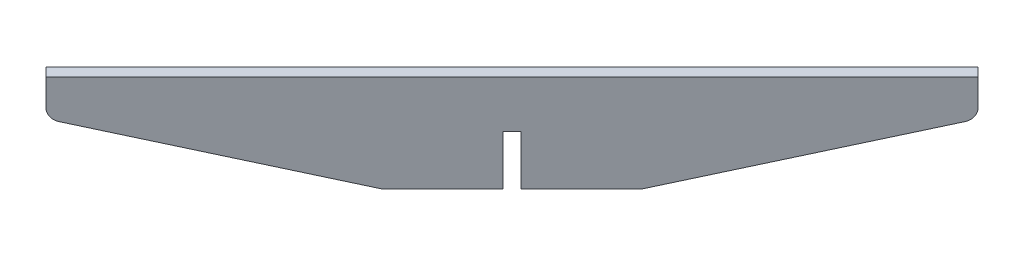
ISO-10303-21;
HEADER;
FILE_DESCRIPTION(('STEP AP214'),'2;1');
FILE_NAME('part.step','',(''),(''),'','','');
FILE_SCHEMA(('AUTOMOTIVE_DESIGN { 1 0 10303 214 1 1 1 1 }'));
ENDSEC;
DATA;
#1=APPLICATION_CONTEXT('core data for automotive mechanical design processes');
#2=APPLICATION_PROTOCOL_DEFINITION('international standard','automotive_design',2000,#1);
#3=PRODUCT_CONTEXT('',#1,'mechanical');
#4=PRODUCT('Part','Part','',(#3));
#5=PRODUCT_RELATED_PRODUCT_CATEGORY('part','',(#4));
#6=PRODUCT_DEFINITION_FORMATION('','',#4);
#7=PRODUCT_DEFINITION_CONTEXT('part definition',#1,'design');
#8=PRODUCT_DEFINITION('design','',#6,#7);
#9=PRODUCT_DEFINITION_SHAPE('','',#8);
#10=(LENGTH_UNIT() NAMED_UNIT(*) SI_UNIT(.MILLI.,.METRE.));
#11=(NAMED_UNIT(*) PLANE_ANGLE_UNIT() SI_UNIT($,.RADIAN.));
#12=(NAMED_UNIT(*) SI_UNIT($,.STERADIAN.) SOLID_ANGLE_UNIT());
#13=UNCERTAINTY_MEASURE_WITH_UNIT(LENGTH_MEASURE(1.E-05),#10,'distance_accuracy_value','');
#14=(GEOMETRIC_REPRESENTATION_CONTEXT(3) GLOBAL_UNCERTAINTY_ASSIGNED_CONTEXT((#13)) GLOBAL_UNIT_ASSIGNED_CONTEXT((#10,
#11,#12)) REPRESENTATION_CONTEXT('',''));
#15=CARTESIAN_POINT('',(0.,0.,0.));
#16=DIRECTION('',(0.,0.,1.));
#17=DIRECTION('',(1.,0.,0.));
#18=AXIS2_PLACEMENT_3D('',#15,#16,#17);
#19=CARTESIAN_POINT('',(56.5685424949238,-65.,-49.4974746830583));
#20=DIRECTION('',(0.,1.,0.));
#21=DIRECTION('',(0.,0.,1.));
#22=AXIS2_PLACEMENT_3D('',#19,#20,#21);
#23=PLANE('',#22);
#24=DIRECTION('',(0.707106781186548,0.,-0.707106781186548));
#25=VECTOR('',#24,1.);
#26=CARTESIAN_POINT('',(56.5685424949238,-65.,-49.4974746830583));
#27=LINE('',#26,#25);
#28=CARTESIAN_POINT('',(7.14177848998415,-65.,-0.0707106781186739));
#29=VERTEX_POINT('',#28);
#30=CARTESIAN_POINT('',(56.5685424949238,-65.,-49.4974746830583));
#31=VERTEX_POINT('',#30);
#32=EDGE_CURVE('E159',#29,#31,#27,.T.);
#33=ORIENTED_EDGE('',*,*,#32,.F.);
#34=DIRECTION('',(-0.707106781186548,0.,-0.707106781186548));
#35=VECTOR('',#34,1.);
#36=CARTESIAN_POINT('',(7.14177848998415,-65.,-0.070710678118667));
#37=LINE('',#36,#35);
#38=CARTESIAN_POINT('',(0.0707106781186731,-65.,-7.14177848998415));
#39=VERTEX_POINT('',#38);
#40=EDGE_CURVE('E215',#29,#39,#37,.T.);
#41=ORIENTED_EDGE('',*,*,#40,.T.);
#42=DIRECTION('',(0.707106781186548,0.,-0.707106781186548));
#43=VECTOR('',#42,1.);
#44=CARTESIAN_POINT('',(49.4974746830583,-65.,-56.5685424949238));
#45=LINE('',#44,#43);
#46=CARTESIAN_POINT('',(49.4974746830583,-65.,-56.5685424949238));
#47=VERTEX_POINT('',#46);
#48=EDGE_CURVE('E151',#39,#47,#45,.T.);
#49=ORIENTED_EDGE('',*,*,#48,.T.);
#50=DIRECTION('',(-0.707106781186548,0.,-0.707106781186548));
#51=VECTOR('',#50,1.);
#52=CARTESIAN_POINT('',(56.5685424949238,-65.,-49.4974746830583));
#53=LINE('',#52,#51);
#54=EDGE_CURVE('E183',#31,#47,#53,.T.);
#55=ORIENTED_EDGE('',*,*,#54,.F.);
#56=EDGE_LOOP('',(#33,#41,#49,#55));
#57=FACE_BOUND('',#56,.T.);
#58=ADVANCED_FACE('F35',(#57),#23,.F.);
#59=CARTESIAN_POINT('',(-195.,15.,187.928932188134));
#60=DIRECTION('',(0.707106781186549,0.,0.707106781186546));
#61=DIRECTION('',(0.707106781186546,0.,-0.707106781186549));
#62=AXIS2_PLACEMENT_3D('',#59,#60,#61);
#63=PLANE('',#62);
#64=DIRECTION('',(0.685115069909655,-0.247456424376855,-0.685115069909655));
#65=VECTOR('',#64,1.);
#66=CARTESIAN_POINT('',(-56.5685424949238,-65.,49.4974746830583));
#67=LINE('',#66,#65);
#68=CARTESIAN_POINT('',(-189.678713345385,-16.9219932920304,182.60764553352));
#69=VERTEX_POINT('',#68);
#70=CARTESIAN_POINT('',(-56.5685424949238,-65.,49.4974746830583));
#71=VERTEX_POINT('',#70);
#72=EDGE_CURVE('E149',#69,#71,#67,.T.);
#73=ORIENTED_EDGE('',*,*,#72,.F.);
#74=CARTESIAN_POINT('',(-187.928932188135,-7.23300305550616,180.857864376269));
#75=DIRECTION('',(0.707106781186549,0.,0.707106781186546));
#76=DIRECTION('',(0.707106781186546,0.,-0.707106781186549));
#77=AXIS2_PLACEMENT_3D('',#74,#75,#76);
#78=CIRCLE('',#77,10.);
#79=CARTESIAN_POINT('',(-195.,-7.23300305550616,187.928932188134));
#80=VERTEX_POINT('',#79);
#81=EDGE_CURVE('E12',#69,#80,#78,.F.);
#82=ORIENTED_EDGE('',*,*,#81,.T.);
#83=DIRECTION('',(0.,-1.,0.));
#84=VECTOR('',#83,1.);
#85=CARTESIAN_POINT('',(-195.,15.,187.928932188134));
#86=LINE('',#85,#84);
#87=CARTESIAN_POINT('',(-195.,15.,187.928932188134));
#88=VERTEX_POINT('',#87);
#89=EDGE_CURVE('E211',#88,#80,#86,.T.);
#90=ORIENTED_EDGE('',*,*,#89,.F.);
#91=DIRECTION('',(-0.707106781186546,0.,0.707106781186549));
#92=VECTOR('',#91,1.);
#93=CARTESIAN_POINT('',(-195.,15.,187.928932188134));
#94=LINE('',#93,#92);
#95=CARTESIAN_POINT('',(187.928932188135,15.,-195.000000000002));
#96=VERTEX_POINT('',#95);
#97=EDGE_CURVE('E194',#96,#88,#94,.T.);
#98=ORIENTED_EDGE('',*,*,#97,.F.);
#99=DIRECTION('',(0.,-1.,0.));
#100=VECTOR('',#99,1.);
#101=CARTESIAN_POINT('',(187.928932188135,15.,-195.000000000002));
#102=LINE('',#101,#100);
#103=CARTESIAN_POINT('',(187.928932188135,-7.23300305550577,-195.000000000002));
#104=VERTEX_POINT('',#103);
#105=EDGE_CURVE('E203',#96,#104,#102,.T.);
#106=ORIENTED_EDGE('',*,*,#105,.T.);
#107=CARTESIAN_POINT('',(180.857864376269,-7.23300305550577,-187.928932188136));
#108=DIRECTION('',(0.707106781186549,0.,0.707106781186546));
#109=DIRECTION('',(0.707106781186546,0.,-0.707106781186549));
#110=AXIS2_PLACEMENT_3D('',#107,#108,#109);
#111=CIRCLE('',#110,10.);
#112=CARTESIAN_POINT('',(182.607645533521,-16.92199329203,-189.678713345386));
#113=VERTEX_POINT('',#112);
#114=EDGE_CURVE('E222',#104,#113,#111,.F.);
#115=ORIENTED_EDGE('',*,*,#114,.T.);
#116=DIRECTION('',(0.685115069909655,0.247456424376855,-0.685115069909655));
#117=VECTOR('',#116,1.);
#118=CARTESIAN_POINT('',(187.928932188134,-15.,-195.));
#119=LINE('',#118,#117);
#120=EDGE_CURVE('E160',#47,#113,#119,.T.);
#121=ORIENTED_EDGE('',*,*,#120,.F.);
#122=ORIENTED_EDGE('',*,*,#48,.F.);
#123=DIRECTION('',(0.,1.,0.));
#124=VECTOR('',#123,1.);
#125=CARTESIAN_POINT('',(0.0707106781181743,15.,-7.14177848998462));
#126=LINE('',#125,#124);
#127=CARTESIAN_POINT('',(0.0707106781181605,-24.,-7.14177848998464));
#128=VERTEX_POINT('',#127);
#129=EDGE_CURVE('E148',#39,#128,#126,.T.);
#130=ORIENTED_EDGE('',*,*,#129,.T.);
#131=DIRECTION('',(-0.707106781186546,0.,0.707106781186549));
#132=VECTOR('',#131,1.);
#133=CARTESIAN_POINT('',(-195.,-24.,187.928932188134));
#134=LINE('',#133,#132);
#135=CARTESIAN_POINT('',(-7.14177848998464,-24.,0.0707106781181743));
#136=VERTEX_POINT('',#135);
#137=EDGE_CURVE('E139',#128,#136,#134,.T.);
#138=ORIENTED_EDGE('',*,*,#137,.T.);
#139=DIRECTION('',(0.,-1.,0.));
#140=VECTOR('',#139,1.);
#141=CARTESIAN_POINT('',(-7.14177848998465,15.,0.0707106781182298));
#142=LINE('',#141,#140);
#143=CARTESIAN_POINT('',(-7.14177848998411,-65.,0.070710678118628));
#144=VERTEX_POINT('',#143);
#145=EDGE_CURVE('E122',#136,#144,#142,.T.);
#146=ORIENTED_EDGE('',*,*,#145,.T.);
#147=EDGE_CURVE('E185',#71,#144,#45,.T.);
#148=ORIENTED_EDGE('',*,*,#147,.F.);
#149=EDGE_LOOP('',(#73,#82,#90,#98,#106,#115,#121,#122,#130,#138,#146,#148));
#150=FACE_BOUND('',#149,.T.);
#151=ADVANCED_FACE('F146',(#150),#63,.F.);
#152=CARTESIAN_POINT('',(-195.,15.,187.928932188134));
#153=DIRECTION('',(0.707106781186545,0.,-0.70710678118655));
#154=DIRECTION('',(-0.70710678118655,0.,-0.707106781186545));
#155=AXIS2_PLACEMENT_3D('',#152,#153,#154);
#156=PLANE('',#155);
#157=ORIENTED_EDGE('',*,*,#89,.T.);
#158=DIRECTION('',(0.70710678118655,0.,0.707106781186545));
#159=VECTOR('',#158,1.);
#160=CARTESIAN_POINT('',(-195.,-7.23300305550617,187.928932188134));
#161=LINE('',#160,#159);
#162=CARTESIAN_POINT('',(-187.928932188134,-7.23300305550617,195.));
#163=VERTEX_POINT('',#162);
#164=EDGE_CURVE('E228',#80,#163,#161,.T.);
#165=ORIENTED_EDGE('',*,*,#164,.T.);
#166=DIRECTION('',(0.,-1.,0.));
#167=VECTOR('',#166,1.);
#168=CARTESIAN_POINT('',(-187.928932188134,15.,195.));
#169=LINE('',#168,#167);
#170=CARTESIAN_POINT('',(-187.928932188134,15.,195.));
#171=VERTEX_POINT('',#170);
#172=EDGE_CURVE('E208',#171,#163,#169,.T.);
#173=ORIENTED_EDGE('',*,*,#172,.F.);
#174=DIRECTION('',(0.70710678118655,0.,0.707106781186545));
#175=VECTOR('',#174,1.);
#176=CARTESIAN_POINT('',(-195.,15.,187.928932188134));
#177=LINE('',#176,#175);
#178=EDGE_CURVE('E197',#88,#171,#177,.T.);
#179=ORIENTED_EDGE('',*,*,#178,.F.);
#180=EDGE_LOOP('',(#157,#165,#173,#179));
#181=FACE_BOUND('',#180,.T.);
#182=ADVANCED_FACE('F234',(#181),#156,.F.);
#183=CARTESIAN_POINT('',(-187.928932188134,15.,195.));
#184=DIRECTION('',(-0.707106781186549,0.,-0.707106781186546));
#185=DIRECTION('',(-0.707106781186546,0.,0.707106781186549));
#186=AXIS2_PLACEMENT_3D('',#183,#184,#185);
#187=PLANE('',#186);
#188=ORIENTED_EDGE('',*,*,#172,.T.);
#189=CARTESIAN_POINT('',(-180.857864376269,-7.23300305550617,187.928932188134));
#190=DIRECTION('',(-0.707106781186549,0.,-0.707106781186546));
#191=DIRECTION('',(-0.707106781186546,0.,0.707106781186549));
#192=AXIS2_PLACEMENT_3D('',#189,#190,#191);
#193=CIRCLE('',#192,10.);
#194=CARTESIAN_POINT('',(-182.60764553352,-16.9219932920304,189.678713345385));
#195=VERTEX_POINT('',#194);
#196=EDGE_CURVE('E57',#163,#195,#193,.F.);
#197=ORIENTED_EDGE('',*,*,#196,.T.);
#198=DIRECTION('',(0.685115069909655,-0.247456424376855,-0.685115069909655));
#199=VECTOR('',#198,1.);
#200=CARTESIAN_POINT('',(-49.4974746830583,-65.,56.5685424949238));
#201=LINE('',#200,#199);
#202=CARTESIAN_POINT('',(-49.4974746830583,-65.,56.5685424949238));
#203=VERTEX_POINT('',#202);
#204=EDGE_CURVE('E156',#195,#203,#201,.T.);
#205=ORIENTED_EDGE('',*,*,#204,.T.);
#206=CARTESIAN_POINT('',(-0.0707106781186288,-65.,7.14177848998411));
#207=VERTEX_POINT('',#206);
#208=EDGE_CURVE('E161',#203,#207,#27,.T.);
#209=ORIENTED_EDGE('',*,*,#208,.T.);
#210=DIRECTION('',(0.,1.,0.));
#211=VECTOR('',#210,1.);
#212=CARTESIAN_POINT('',(-0.070710678119118,15.,7.14177848998368));
#213=LINE('',#212,#211);
#214=CARTESIAN_POINT('',(-0.070710678119118,-24.,7.14177848998365));
#215=VERTEX_POINT('',#214);
#216=EDGE_CURVE('E134',#207,#215,#213,.T.);
#217=ORIENTED_EDGE('',*,*,#216,.T.);
#218=DIRECTION('',(0.707106781186546,0.,-0.707106781186549));
#219=VECTOR('',#218,1.);
#220=CARTESIAN_POINT('',(-187.928932188134,-24.,195.));
#221=LINE('',#220,#219);
#222=CARTESIAN_POINT('',(7.14177848998365,-24.,-0.0707106781191597));
#223=VERTEX_POINT('',#222);
#224=EDGE_CURVE('E142',#215,#223,#221,.T.);
#225=ORIENTED_EDGE('',*,*,#224,.T.);
#226=DIRECTION('',(0.,-1.,0.));
#227=VECTOR('',#226,1.);
#228=CARTESIAN_POINT('',(7.14177848998368,15.,-0.0707106781191458));
#229=LINE('',#228,#227);
#230=EDGE_CURVE('E133',#223,#29,#229,.T.);
#231=ORIENTED_EDGE('',*,*,#230,.T.);
#232=ORIENTED_EDGE('',*,*,#32,.T.);
#233=DIRECTION('',(0.685115069909655,0.247456424376855,-0.685115069909655));
#234=VECTOR('',#233,1.);
#235=CARTESIAN_POINT('',(195.,-15.,-187.928932188134));
#236=LINE('',#235,#234);
#237=CARTESIAN_POINT('',(189.678713345386,-16.92199329203,-182.607645533521));
#238=VERTEX_POINT('',#237);
#239=EDGE_CURVE('E180',#31,#238,#236,.T.);
#240=ORIENTED_EDGE('',*,*,#239,.T.);
#241=CARTESIAN_POINT('',(187.928932188135,-7.23300305550576,-180.857864376271));
#242=DIRECTION('',(-0.707106781186549,0.,-0.707106781186546));
#243=DIRECTION('',(-0.707106781186546,0.,0.707106781186549));
#244=AXIS2_PLACEMENT_3D('',#241,#242,#243);
#245=CIRCLE('',#244,10.);
#246=CARTESIAN_POINT('',(195.,-7.23300305550576,-187.928932188137));
#247=VERTEX_POINT('',#246);
#248=EDGE_CURVE('E226',#238,#247,#245,.F.);
#249=ORIENTED_EDGE('',*,*,#248,.T.);
#250=DIRECTION('',(0.,-1.,0.));
#251=VECTOR('',#250,1.);
#252=CARTESIAN_POINT('',(195.,15.,-187.928932188137));
#253=LINE('',#252,#251);
#254=CARTESIAN_POINT('',(195.,15.,-187.928932188137));
#255=VERTEX_POINT('',#254);
#256=EDGE_CURVE('E205',#255,#247,#253,.T.);
#257=ORIENTED_EDGE('',*,*,#256,.F.);
#258=DIRECTION('',(0.707106781186546,0.,-0.707106781186549));
#259=VECTOR('',#258,1.);
#260=CARTESIAN_POINT('',(-187.928932188134,15.,195.));
#261=LINE('',#260,#259);
#262=EDGE_CURVE('E198',#171,#255,#261,.T.);
#263=ORIENTED_EDGE('',*,*,#262,.F.);
#264=EDGE_LOOP('',(#188,#197,#205,#209,#217,#225,#231,#232,#240,#249,#257,#263));
#265=FACE_BOUND('',#264,.T.);
#266=ADVANCED_FACE('F239',(#265),#187,.F.);
#267=CARTESIAN_POINT('',(187.928932188135,15.,-195.000000000002));
#268=DIRECTION('',(-0.707106781186545,0.,0.70710678118655));
#269=DIRECTION('',(0.70710678118655,0.,0.707106781186545));
#270=AXIS2_PLACEMENT_3D('',#267,#268,#269);
#271=PLANE('',#270);
#272=ORIENTED_EDGE('',*,*,#256,.T.);
#273=DIRECTION('',(-0.70710678118655,0.,-0.707106781186545));
#274=VECTOR('',#273,1.);
#275=CARTESIAN_POINT('',(187.928932188135,-7.23300305550577,-195.000000000002));
#276=LINE('',#275,#274);
#277=EDGE_CURVE('E219',#247,#104,#276,.T.);
#278=ORIENTED_EDGE('',*,*,#277,.T.);
#279=ORIENTED_EDGE('',*,*,#105,.F.);
#280=DIRECTION('',(-0.70710678118655,0.,-0.707106781186545));
#281=VECTOR('',#280,1.);
#282=CARTESIAN_POINT('',(187.928932188135,15.,-195.000000000002));
#283=LINE('',#282,#281);
#284=EDGE_CURVE('E201',#255,#96,#283,.T.);
#285=ORIENTED_EDGE('',*,*,#284,.F.);
#286=EDGE_LOOP('',(#272,#278,#279,#285));
#287=FACE_BOUND('',#286,.T.);
#288=ADVANCED_FACE('F282',(#287),#271,.F.);
#289=CARTESIAN_POINT('',(0.,15.,0.));
#290=DIRECTION('',(0.,-1.,0.));
#291=DIRECTION('',(0.,0.,-1.));
#292=AXIS2_PLACEMENT_3D('',#289,#290,#291);
#293=PLANE('',#292);
#294=ORIENTED_EDGE('',*,*,#97,.T.);
#295=ORIENTED_EDGE('',*,*,#178,.T.);
#296=ORIENTED_EDGE('',*,*,#262,.T.);
#297=ORIENTED_EDGE('',*,*,#284,.T.);
#298=EDGE_LOOP('',(#294,#295,#296,#297));
#299=FACE_BOUND('',#298,.T.);
#300=ADVANCED_FACE('F243',(#299),#293,.F.);
#301=CARTESIAN_POINT('',(-49.4974746830583,-65.,56.5685424949238));
#302=DIRECTION('',(0.17497811572505,0.968899023652425,-0.17497811572505));
#303=DIRECTION('',(0.,0.177719921285182,0.984081109247804));
#304=AXIS2_PLACEMENT_3D('',#301,#302,#303);
#305=PLANE('',#304);
#306=ORIENTED_EDGE('',*,*,#204,.F.);
#307=DIRECTION('',(0.70710678118655,0.,0.707106781186545));
#308=VECTOR('',#307,1.);
#309=CARTESIAN_POINT('',(-182.607645533519,-16.9219932920304,189.678713345386));
#310=LINE('',#309,#308);
#311=EDGE_CURVE('E43',#195,#69,#310,.F.);
#312=ORIENTED_EDGE('',*,*,#311,.T.);
#313=ORIENTED_EDGE('',*,*,#72,.T.);
#314=DIRECTION('',(-0.707106781186548,0.,-0.707106781186548));
#315=VECTOR('',#314,1.);
#316=CARTESIAN_POINT('',(-49.4974746830583,-65.,56.5685424949238));
#317=LINE('',#316,#315);
#318=EDGE_CURVE('E191',#203,#71,#317,.T.);
#319=ORIENTED_EDGE('',*,*,#318,.F.);
#320=EDGE_LOOP('',(#306,#312,#313,#319));
#321=FACE_BOUND('',#320,.T.);
#322=ADVANCED_FACE('F265',(#321),#305,.F.);
#323=ORIENTED_EDGE('',*,*,#147,.T.);
#324=DIRECTION('',(0.707106781186548,0.,0.707106781186548));
#325=VECTOR('',#324,1.);
#326=CARTESIAN_POINT('',(-0.0707106781186392,-65.,7.14177848998412));
#327=LINE('',#326,#325);
#328=EDGE_CURVE('E128',#144,#207,#327,.T.);
#329=ORIENTED_EDGE('',*,*,#328,.T.);
#330=ORIENTED_EDGE('',*,*,#208,.F.);
#331=ORIENTED_EDGE('',*,*,#318,.T.);
#332=EDGE_LOOP('',(#323,#329,#330,#331));
#333=FACE_BOUND('',#332,.T.);
#334=ADVANCED_FACE('F255',(#333),#23,.F.);
#335=CARTESIAN_POINT('',(195.,-15.,-187.928932188134));
#336=DIRECTION('',(-0.17497811572505,0.968899023652425,0.17497811572505));
#337=DIRECTION('',(0.,-0.177719921285182,0.984081109247804));
#338=AXIS2_PLACEMENT_3D('',#335,#336,#337);
#339=PLANE('',#338);
#340=ORIENTED_EDGE('',*,*,#120,.T.);
#341=DIRECTION('',(-0.70710678118655,0.,-0.707106781186545));
#342=VECTOR('',#341,1.);
#343=CARTESIAN_POINT('',(189.678713345386,-16.92199329203,-182.607645533521));
#344=LINE('',#343,#342);
#345=EDGE_CURVE('E224',#113,#238,#344,.F.);
#346=ORIENTED_EDGE('',*,*,#345,.T.);
#347=ORIENTED_EDGE('',*,*,#239,.F.);
#348=ORIENTED_EDGE('',*,*,#54,.T.);
#349=EDGE_LOOP('',(#340,#346,#347,#348));
#350=FACE_BOUND('',#349,.T.);
#351=ADVANCED_FACE('F264',(#350),#339,.F.);
#352=CARTESIAN_POINT('',(-198.606244584052,-24.,-191.39375541595));
#353=DIRECTION('',(0.,1.,0.));
#354=DIRECTION('',(0.,0.,1.));
#355=AXIS2_PLACEMENT_3D('',#352,#353,#354);
#356=PLANE('',#355);
#357=DIRECTION('',(0.707106781186547,0.,0.707106781186547));
#358=VECTOR('',#357,1.);
#359=CARTESIAN_POINT('',(-191.39375541595,-24.,-198.606244584052));
#360=LINE('',#359,#358);
#361=EDGE_CURVE('E143',#128,#223,#360,.T.);
#362=ORIENTED_EDGE('',*,*,#361,.T.);
#363=ORIENTED_EDGE('',*,*,#224,.F.);
#364=DIRECTION('',(0.707106781186547,0.,0.707106781186547));
#365=VECTOR('',#364,1.);
#366=CARTESIAN_POINT('',(-198.606244584052,-24.,-191.39375541595));
#367=LINE('',#366,#365);
#368=EDGE_CURVE('E125',#136,#215,#367,.T.);
#369=ORIENTED_EDGE('',*,*,#368,.F.);
#370=ORIENTED_EDGE('',*,*,#137,.F.);
#371=EDGE_LOOP('',(#362,#363,#369,#370));
#372=FACE_BOUND('',#371,.T.);
#373=ADVANCED_FACE('F138',(#372),#356,.F.);
#374=CARTESIAN_POINT('',(-191.39375541595,-106.,-198.606244584052));
#375=DIRECTION('',(0.707106781186547,0.,-0.707106781186547));
#376=DIRECTION('',(-0.707106781186548,0.,-0.707106781186548));
#377=AXIS2_PLACEMENT_3D('',#374,#375,#376);
#378=PLANE('',#377);
#379=ORIENTED_EDGE('',*,*,#40,.F.);
#380=ORIENTED_EDGE('',*,*,#230,.F.);
#381=ORIENTED_EDGE('',*,*,#361,.F.);
#382=ORIENTED_EDGE('',*,*,#129,.F.);
#383=EDGE_LOOP('',(#379,#380,#381,#382));
#384=FACE_BOUND('',#383,.T.);
#385=ADVANCED_FACE('F330',(#384),#378,.F.);
#386=CARTESIAN_POINT('',(-198.606244584052,-106.,-191.39375541595));
#387=DIRECTION('',(-0.707106781186547,0.,0.707106781186547));
#388=DIRECTION('',(0.707106781186548,0.,0.707106781186548));
#389=AXIS2_PLACEMENT_3D('',#386,#387,#388);
#390=PLANE('',#389);
#391=ORIENTED_EDGE('',*,*,#368,.T.);
#392=ORIENTED_EDGE('',*,*,#216,.F.);
#393=ORIENTED_EDGE('',*,*,#328,.F.);
#394=ORIENTED_EDGE('',*,*,#145,.F.);
#395=EDGE_LOOP('',(#391,#392,#393,#394));
#396=FACE_BOUND('',#395,.T.);
#397=ADVANCED_FACE('F124',(#396),#390,.F.);
#398=CARTESIAN_POINT('',(180.857864376269,-7.23300305550577,-187.928932188136));
#399=DIRECTION('',(-0.70710678118655,0.,-0.707106781186545));
#400=DIRECTION('',(-0.707106781186545,0.,0.70710678118655));
#401=AXIS2_PLACEMENT_3D('',#398,#399,#400);
#402=CYLINDRICAL_SURFACE('',#401,10.);
#403=ORIENTED_EDGE('',*,*,#248,.F.);
#404=ORIENTED_EDGE('',*,*,#345,.F.);
#405=ORIENTED_EDGE('',*,*,#114,.F.);
#406=ORIENTED_EDGE('',*,*,#277,.F.);
#407=EDGE_LOOP('',(#403,#404,#405,#406));
#408=FACE_BOUND('',#407,.T.);
#409=ADVANCED_FACE('F247',(#408),#402,.T.);
#410=CARTESIAN_POINT('',(-187.928932188135,-7.23300305550616,180.857864376269));
#411=DIRECTION('',(0.70710678118655,0.,0.707106781186545));
#412=DIRECTION('',(0.707106781186545,0.,-0.70710678118655));
#413=AXIS2_PLACEMENT_3D('',#410,#411,#412);
#414=CYLINDRICAL_SURFACE('',#413,10.);
#415=ORIENTED_EDGE('',*,*,#81,.F.);
#416=ORIENTED_EDGE('',*,*,#311,.F.);
#417=ORIENTED_EDGE('',*,*,#196,.F.);
#418=ORIENTED_EDGE('',*,*,#164,.F.);
#419=EDGE_LOOP('',(#415,#416,#417,#418));
#420=FACE_BOUND('',#419,.T.);
#421=ADVANCED_FACE('F37',(#420),#414,.T.);
#422=CLOSED_SHELL('',(#58,#151,#182,#266,#288,#300,#322,#334,#351,#373,#385,#397,#409,#421));
#423=MANIFOLD_SOLID_BREP('B2',#422);
#424=ADVANCED_BREP_SHAPE_REPRESENTATION('',(#18,#423),#14);
#425=SHAPE_DEFINITION_REPRESENTATION(#9,#424);
ENDSEC;
END-ISO-10303-21;
